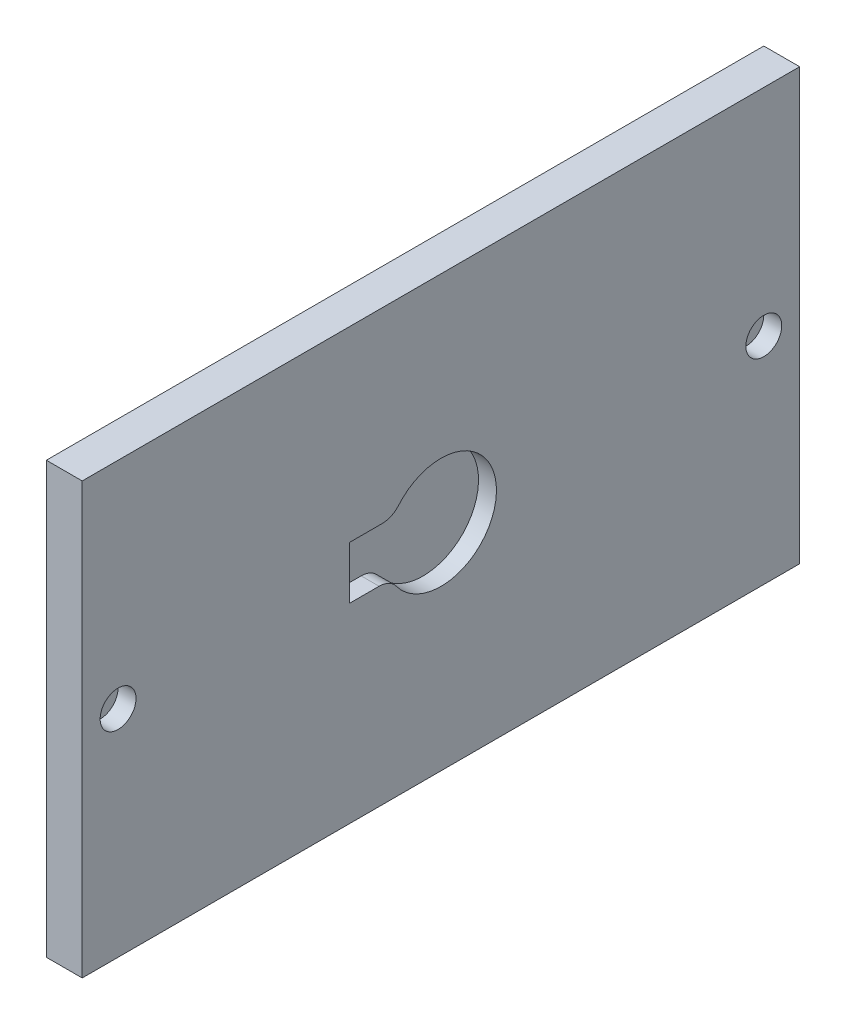
ISO-10303-21;
HEADER;
FILE_DESCRIPTION(('STEP AP214'),'2;1');
FILE_NAME('part.step','',(''),(''),'','','');
FILE_SCHEMA(('AUTOMOTIVE_DESIGN { 1 0 10303 214 1 1 1 1 }'));
ENDSEC;
DATA;
#1=APPLICATION_CONTEXT('core data for automotive mechanical design processes');
#2=APPLICATION_PROTOCOL_DEFINITION('international standard','automotive_design',2000,#1);
#3=PRODUCT_CONTEXT('',#1,'mechanical');
#4=PRODUCT('Part','Part','',(#3));
#5=PRODUCT_RELATED_PRODUCT_CATEGORY('part','',(#4));
#6=PRODUCT_DEFINITION_FORMATION('','',#4);
#7=PRODUCT_DEFINITION_CONTEXT('part definition',#1,'design');
#8=PRODUCT_DEFINITION('design','',#6,#7);
#9=PRODUCT_DEFINITION_SHAPE('','',#8);
#10=(LENGTH_UNIT() NAMED_UNIT(*) SI_UNIT(.MILLI.,.METRE.));
#11=(NAMED_UNIT(*) PLANE_ANGLE_UNIT() SI_UNIT($,.RADIAN.));
#12=(NAMED_UNIT(*) SI_UNIT($,.STERADIAN.) SOLID_ANGLE_UNIT());
#13=UNCERTAINTY_MEASURE_WITH_UNIT(LENGTH_MEASURE(1.E-05),#10,'distance_accuracy_value','');
#14=(GEOMETRIC_REPRESENTATION_CONTEXT(3) GLOBAL_UNCERTAINTY_ASSIGNED_CONTEXT((#13)) GLOBAL_UNIT_ASSIGNED_CONTEXT((#10,
#11,#12)) REPRESENTATION_CONTEXT('',''));
#15=CARTESIAN_POINT('',(0.,0.,0.));
#16=DIRECTION('',(0.,0.,1.));
#17=DIRECTION('',(1.,0.,0.));
#18=AXIS2_PLACEMENT_3D('',#15,#16,#17);
#19=CARTESIAN_POINT('',(12.7,-76.2,127.));
#20=DIRECTION('',(0.,0.,-1.));
#21=DIRECTION('',(-1.,0.,0.));
#22=AXIS2_PLACEMENT_3D('',#19,#20,#21);
#23=PLANE('',#22);
#24=DIRECTION('',(0.,-1.,0.));
#25=VECTOR('',#24,1.);
#26=CARTESIAN_POINT('',(0.,-76.2,127.));
#27=LINE('',#26,#25);
#28=CARTESIAN_POINT('',(0.,76.2,127.));
#29=VERTEX_POINT('',#28);
#30=CARTESIAN_POINT('',(0.,-76.2,127.));
#31=VERTEX_POINT('',#30);
#32=EDGE_CURVE('E168',#29,#31,#27,.T.);
#33=ORIENTED_EDGE('',*,*,#32,.T.);
#34=DIRECTION('',(-1.,0.,0.));
#35=VECTOR('',#34,1.);
#36=CARTESIAN_POINT('',(12.7,-76.2,127.));
#37=LINE('',#36,#35);
#38=CARTESIAN_POINT('',(12.7,-76.2,127.));
#39=VERTEX_POINT('',#38);
#40=EDGE_CURVE('E203',#39,#31,#37,.T.);
#41=ORIENTED_EDGE('',*,*,#40,.F.);
#42=DIRECTION('',(0.,-1.,0.));
#43=VECTOR('',#42,1.);
#44=CARTESIAN_POINT('',(12.7,-76.2,127.));
#45=LINE('',#44,#43);
#46=CARTESIAN_POINT('',(12.7,76.2,127.));
#47=VERTEX_POINT('',#46);
#48=EDGE_CURVE('E177',#47,#39,#45,.T.);
#49=ORIENTED_EDGE('',*,*,#48,.F.);
#50=DIRECTION('',(-1.,0.,0.));
#51=VECTOR('',#50,1.);
#52=CARTESIAN_POINT('',(12.7,76.2,127.));
#53=LINE('',#52,#51);
#54=EDGE_CURVE('E187',#47,#29,#53,.T.);
#55=ORIENTED_EDGE('',*,*,#54,.T.);
#56=EDGE_LOOP('',(#33,#41,#49,#55));
#57=FACE_BOUND('',#56,.T.);
#58=ADVANCED_FACE('F33',(#57),#23,.F.);
#59=CARTESIAN_POINT('',(12.7,-76.2,-127.));
#60=DIRECTION('',(0.,1.,0.));
#61=DIRECTION('',(0.,0.,1.));
#62=AXIS2_PLACEMENT_3D('',#59,#60,#61);
#63=PLANE('',#62);
#64=CARTESIAN_POINT('',(6.23633701428616,-76.2,114.3));
#65=DIRECTION('',(0.,-1.,0.));
#66=DIRECTION('',(0.,0.,-1.));
#67=AXIS2_PLACEMENT_3D('',#64,#65,#66);
#68=CIRCLE('',#67,3.17499999999999);
#69=CARTESIAN_POINT('',(6.23633701428616,-76.2,111.125));
#70=VERTEX_POINT('',#69);
#71=EDGE_CURVE('E142',#70,#70,#68,.T.);
#72=ORIENTED_EDGE('',*,*,#71,.F.);
#73=EDGE_LOOP('',(#72));
#74=FACE_BOUND('',#73,.T.);
#75=CARTESIAN_POINT('',(6.23633701428616,-76.2,0.));
#76=DIRECTION('',(0.,-1.,0.));
#77=DIRECTION('',(0.,0.,-1.));
#78=AXIS2_PLACEMENT_3D('',#75,#76,#77);
#79=CIRCLE('',#78,3.17499999999999);
#80=CARTESIAN_POINT('',(6.23633701428616,-76.2,-3.175));
#81=VERTEX_POINT('',#80);
#82=EDGE_CURVE('E152',#81,#81,#79,.T.);
#83=ORIENTED_EDGE('',*,*,#82,.F.);
#84=EDGE_LOOP('',(#83));
#85=FACE_BOUND('',#84,.T.);
#86=CARTESIAN_POINT('',(6.23633701428616,-76.2,-114.3));
#87=DIRECTION('',(0.,-1.,0.));
#88=DIRECTION('',(0.,0.,-1.));
#89=AXIS2_PLACEMENT_3D('',#86,#87,#88);
#90=CIRCLE('',#89,3.17499999999999);
#91=CARTESIAN_POINT('',(6.23633701428616,-76.2,-117.475));
#92=VERTEX_POINT('',#91);
#93=EDGE_CURVE('E158',#92,#92,#90,.T.);
#94=ORIENTED_EDGE('',*,*,#93,.F.);
#95=EDGE_LOOP('',(#94));
#96=FACE_BOUND('',#95,.T.);
#97=DIRECTION('',(0.,0.,-1.));
#98=VECTOR('',#97,1.);
#99=CARTESIAN_POINT('',(0.,-76.2,-127.));
#100=LINE('',#99,#98);
#101=CARTESIAN_POINT('',(0.,-76.2,-127.));
#102=VERTEX_POINT('',#101);
#103=EDGE_CURVE('E190',#31,#102,#100,.T.);
#104=ORIENTED_EDGE('',*,*,#103,.T.);
#105=DIRECTION('',(-1.,0.,0.));
#106=VECTOR('',#105,1.);
#107=CARTESIAN_POINT('',(12.7,-76.2,-127.));
#108=LINE('',#107,#106);
#109=CARTESIAN_POINT('',(12.7,-76.2,-127.));
#110=VERTEX_POINT('',#109);
#111=EDGE_CURVE('E200',#110,#102,#108,.T.);
#112=ORIENTED_EDGE('',*,*,#111,.F.);
#113=DIRECTION('',(0.,0.,-1.));
#114=VECTOR('',#113,1.);
#115=CARTESIAN_POINT('',(12.7,-76.2,-127.));
#116=LINE('',#115,#114);
#117=EDGE_CURVE('E180',#39,#110,#116,.T.);
#118=ORIENTED_EDGE('',*,*,#117,.F.);
#119=ORIENTED_EDGE('',*,*,#40,.T.);
#120=EDGE_LOOP('',(#104,#112,#118,#119));
#121=FACE_BOUND('',#120,.T.);
#122=ADVANCED_FACE('F244',(#74,#85,#96,#121),#63,.F.);
#123=CARTESIAN_POINT('',(12.7,-76.2,-127.));
#124=DIRECTION('',(0.,0.,1.));
#125=DIRECTION('',(1.,0.,0.));
#126=AXIS2_PLACEMENT_3D('',#123,#124,#125);
#127=PLANE('',#126);
#128=DIRECTION('',(0.,1.,0.));
#129=VECTOR('',#128,1.);
#130=CARTESIAN_POINT('',(0.,-76.2,-127.));
#131=LINE('',#130,#129);
#132=CARTESIAN_POINT('',(0.,76.2,-127.));
#133=VERTEX_POINT('',#132);
#134=EDGE_CURVE('E192',#102,#133,#131,.T.);
#135=ORIENTED_EDGE('',*,*,#134,.T.);
#136=DIRECTION('',(-1.,0.,0.));
#137=VECTOR('',#136,1.);
#138=CARTESIAN_POINT('',(12.7,76.2,-127.));
#139=LINE('',#138,#137);
#140=CARTESIAN_POINT('',(12.7,76.2,-127.));
#141=VERTEX_POINT('',#140);
#142=EDGE_CURVE('E197',#141,#133,#139,.T.);
#143=ORIENTED_EDGE('',*,*,#142,.F.);
#144=DIRECTION('',(0.,1.,0.));
#145=VECTOR('',#144,1.);
#146=CARTESIAN_POINT('',(12.7,-76.2,-127.));
#147=LINE('',#146,#145);
#148=EDGE_CURVE('E183',#110,#141,#147,.T.);
#149=ORIENTED_EDGE('',*,*,#148,.F.);
#150=ORIENTED_EDGE('',*,*,#111,.T.);
#151=EDGE_LOOP('',(#135,#143,#149,#150));
#152=FACE_BOUND('',#151,.T.);
#153=ADVANCED_FACE('F250',(#152),#127,.F.);
#154=CARTESIAN_POINT('',(12.7,76.2,-127.));
#155=DIRECTION('',(0.,-1.,0.));
#156=DIRECTION('',(0.,0.,-1.));
#157=AXIS2_PLACEMENT_3D('',#154,#155,#156);
#158=PLANE('',#157);
#159=DIRECTION('',(0.,0.,1.));
#160=VECTOR('',#159,1.);
#161=CARTESIAN_POINT('',(0.,76.2,-127.));
#162=LINE('',#161,#160);
#163=EDGE_CURVE('E181',#133,#29,#162,.T.);
#164=ORIENTED_EDGE('',*,*,#163,.T.);
#165=ORIENTED_EDGE('',*,*,#54,.F.);
#166=DIRECTION('',(0.,0.,1.));
#167=VECTOR('',#166,1.);
#168=CARTESIAN_POINT('',(12.7,76.2,-127.));
#169=LINE('',#168,#167);
#170=EDGE_CURVE('E185',#141,#47,#169,.T.);
#171=ORIENTED_EDGE('',*,*,#170,.F.);
#172=ORIENTED_EDGE('',*,*,#142,.T.);
#173=EDGE_LOOP('',(#164,#165,#171,#172));
#174=FACE_BOUND('',#173,.T.);
#175=ADVANCED_FACE('F256',(#174),#158,.F.);
#176=CARTESIAN_POINT('',(12.7,0.,0.));
#177=DIRECTION('',(1.,0.,0.));
#178=DIRECTION('',(0.,0.,-1.));
#179=AXIS2_PLACEMENT_3D('',#176,#177,#178);
#180=PLANE('',#179);
#181=CARTESIAN_POINT('',(12.7,0.,0.));
#182=DIRECTION('',(1.,0.,0.));
#183=DIRECTION('',(0.,0.,-1.));
#184=AXIS2_PLACEMENT_3D('',#181,#182,#183);
#185=CIRCLE('',#184,19.6517881120269);
#186=CARTESIAN_POINT('',(12.7,-11.7131699635064,15.779557199301));
#187=VERTEX_POINT('',#186);
#188=CARTESIAN_POINT('',(12.7,12.7204921921849,14.9793809748121));
#189=VERTEX_POINT('',#188);
#190=EDGE_CURVE('E232',#187,#189,#185,.T.);
#191=ORIENTED_EDGE('',*,*,#190,.F.);
#192=CARTESIAN_POINT('',(12.7,-16.2549630366414,21.89809588765));
#193=DIRECTION('',(1.,0.,0.));
#194=DIRECTION('',(0.,0.,-1.));
#195=AXIS2_PLACEMENT_3D('',#192,#193,#194);
#196=CIRCLE('',#195,7.62);
#197=CARTESIAN_POINT('',(12.7,-8.63496303664135,21.89809588765));
#198=VERTEX_POINT('',#197);
#199=EDGE_CURVE('E213',#187,#198,#196,.T.);
#200=ORIENTED_EDGE('',*,*,#199,.T.);
#201=DIRECTION('',(0.,0.,1.));
#202=VECTOR('',#201,1.);
#203=CARTESIAN_POINT('',(12.7,-8.63496303664135,0.));
#204=LINE('',#203,#202);
#205=CARTESIAN_POINT('',(12.7,-8.63496303664135,32.324736447741));
#206=VERTEX_POINT('',#205);
#207=EDGE_CURVE('E226',#198,#206,#204,.T.);
#208=ORIENTED_EDGE('',*,*,#207,.T.);
#209=DIRECTION('',(0.,1.,0.));
#210=VECTOR('',#209,1.);
#211=CARTESIAN_POINT('',(12.7,0.,32.324736447741));
#212=LINE('',#211,#210);
#213=CARTESIAN_POINT('',(12.7,10.0328754415813,32.324736447741));
#214=VERTEX_POINT('',#213);
#215=EDGE_CURVE('E234',#206,#214,#212,.T.);
#216=ORIENTED_EDGE('',*,*,#215,.T.);
#217=DIRECTION('',(0.,0.,1.));
#218=VECTOR('',#217,1.);
#219=CARTESIAN_POINT('',(12.7,10.0328754415813,0.));
#220=LINE('',#219,#218);
#221=CARTESIAN_POINT('',(12.7,10.0328754415813,20.7876505519817));
#222=VERTEX_POINT('',#221);
#223=EDGE_CURVE('E140',#222,#214,#220,.T.);
#224=ORIENTED_EDGE('',*,*,#223,.F.);
#225=CARTESIAN_POINT('',(12.7,17.6528754415813,20.7876505519817));
#226=DIRECTION('',(1.,0.,0.));
#227=DIRECTION('',(0.,0.,-1.));
#228=AXIS2_PLACEMENT_3D('',#225,#226,#227);
#229=CIRCLE('',#228,7.62);
#230=EDGE_CURVE('E211',#222,#189,#229,.T.);
#231=ORIENTED_EDGE('',*,*,#230,.T.);
#232=EDGE_LOOP('',(#191,#200,#208,#216,#224,#231));
#233=FACE_BOUND('',#232,.T.);
#234=CARTESIAN_POINT('',(12.7,0.,-114.3));
#235=DIRECTION('',(1.,0.,0.));
#236=DIRECTION('',(0.,0.,-1.));
#237=AXIS2_PLACEMENT_3D('',#234,#235,#236);
#238=CIRCLE('',#237,6.35);
#239=CARTESIAN_POINT('',(12.7,0.,-120.65));
#240=VERTEX_POINT('',#239);
#241=EDGE_CURVE('E169',#240,#240,#238,.T.);
#242=ORIENTED_EDGE('',*,*,#241,.F.);
#243=EDGE_LOOP('',(#242));
#244=FACE_BOUND('',#243,.T.);
#245=CARTESIAN_POINT('',(12.7,0.,114.3));
#246=DIRECTION('',(1.,0.,0.));
#247=DIRECTION('',(0.,0.,-1.));
#248=AXIS2_PLACEMENT_3D('',#245,#246,#247);
#249=CIRCLE('',#248,6.35);
#250=CARTESIAN_POINT('',(12.7,0.,107.95));
#251=VERTEX_POINT('',#250);
#252=EDGE_CURVE('E164',#251,#251,#249,.T.);
#253=ORIENTED_EDGE('',*,*,#252,.F.);
#254=EDGE_LOOP('',(#253));
#255=FACE_BOUND('',#254,.T.);
#256=ORIENTED_EDGE('',*,*,#48,.T.);
#257=ORIENTED_EDGE('',*,*,#117,.T.);
#258=ORIENTED_EDGE('',*,*,#148,.T.);
#259=ORIENTED_EDGE('',*,*,#170,.T.);
#260=EDGE_LOOP('',(#256,#257,#258,#259));
#261=FACE_BOUND('',#260,.T.);
#262=ADVANCED_FACE('F230',(#233,#244,#255,#261),#180,.T.);
#263=CARTESIAN_POINT('',(0.,0.,0.));
#264=DIRECTION('',(1.,0.,0.));
#265=DIRECTION('',(0.,0.,-1.));
#266=AXIS2_PLACEMENT_3D('',#263,#264,#265);
#267=PLANE('',#266);
#268=ORIENTED_EDGE('',*,*,#32,.F.);
#269=ORIENTED_EDGE('',*,*,#163,.F.);
#270=ORIENTED_EDGE('',*,*,#134,.F.);
#271=ORIENTED_EDGE('',*,*,#103,.F.);
#272=EDGE_LOOP('',(#268,#269,#270,#271));
#273=FACE_BOUND('',#272,.T.);
#274=ADVANCED_FACE('F261',(#273),#267,.F.);
#275=CARTESIAN_POINT('',(6.35,0.,114.3));
#276=DIRECTION('',(1.,0.,0.));
#277=DIRECTION('',(0.,0.,-1.));
#278=AXIS2_PLACEMENT_3D('',#275,#276,#277);
#279=CYLINDRICAL_SURFACE('',#278,6.35);
#280=CARTESIAN_POINT('',(6.35,0.,114.3));
#281=DIRECTION('',(1.,0.,0.));
#282=DIRECTION('',(0.,0.,-1.));
#283=AXIS2_PLACEMENT_3D('',#280,#281,#282);
#284=CIRCLE('',#283,6.35);
#285=CARTESIAN_POINT('',(6.35,0.,107.95));
#286=VERTEX_POINT('',#285);
#287=EDGE_CURVE('E172',#286,#286,#284,.T.);
#288=ORIENTED_EDGE('',*,*,#287,.F.);
#289=EDGE_LOOP('',(#288));
#290=FACE_BOUND('',#289,.T.);
#291=ORIENTED_EDGE('',*,*,#252,.T.);
#292=EDGE_LOOP('',(#291));
#293=FACE_BOUND('',#292,.T.);
#294=ADVANCED_FACE('F264',(#290,#293),#279,.F.);
#295=CARTESIAN_POINT('',(6.35,0.,114.3));
#296=DIRECTION('',(1.,0.,0.));
#297=DIRECTION('',(0.,0.,-1.));
#298=AXIS2_PLACEMENT_3D('',#295,#296,#297);
#299=PLANE('',#298);
#300=ORIENTED_EDGE('',*,*,#287,.T.);
#301=EDGE_LOOP('',(#300));
#302=FACE_BOUND('',#301,.T.);
#303=ADVANCED_FACE('F270',(#302),#299,.T.);
#304=CARTESIAN_POINT('',(6.35,0.,-114.3));
#305=DIRECTION('',(1.,0.,0.));
#306=DIRECTION('',(0.,0.,-1.));
#307=AXIS2_PLACEMENT_3D('',#304,#305,#306);
#308=CYLINDRICAL_SURFACE('',#307,6.35);
#309=CARTESIAN_POINT('',(6.35,0.,-114.3));
#310=DIRECTION('',(1.,0.,0.));
#311=DIRECTION('',(0.,0.,-1.));
#312=AXIS2_PLACEMENT_3D('',#309,#310,#311);
#313=CIRCLE('',#312,6.35);
#314=CARTESIAN_POINT('',(6.35,0.,-120.65));
#315=VERTEX_POINT('',#314);
#316=EDGE_CURVE('E165',#315,#315,#313,.T.);
#317=ORIENTED_EDGE('',*,*,#316,.F.);
#318=EDGE_LOOP('',(#317));
#319=FACE_BOUND('',#318,.T.);
#320=ORIENTED_EDGE('',*,*,#241,.T.);
#321=EDGE_LOOP('',(#320));
#322=FACE_BOUND('',#321,.T.);
#323=ADVANCED_FACE('F274',(#319,#322),#308,.F.);
#324=CARTESIAN_POINT('',(6.35,0.,-114.3));
#325=DIRECTION('',(1.,0.,0.));
#326=DIRECTION('',(0.,0.,-1.));
#327=AXIS2_PLACEMENT_3D('',#324,#325,#326);
#328=PLANE('',#327);
#329=ORIENTED_EDGE('',*,*,#316,.T.);
#330=EDGE_LOOP('',(#329));
#331=FACE_BOUND('',#330,.T.);
#332=ADVANCED_FACE('F278',(#331),#328,.T.);
#333=CARTESIAN_POINT('',(6.23633701428616,-63.5,-114.3));
#334=DIRECTION('',(0.,-1.,0.));
#335=DIRECTION('',(0.,0.,-1.));
#336=AXIS2_PLACEMENT_3D('',#333,#334,#335);
#337=CONICAL_SURFACE('',#336,3.17499999999999,1.02974425867665);
#338=CARTESIAN_POINT('',(6.23633701428616,-61.5922675345875,-114.3));
#339=VERTEX_POINT('',#338);
#340=VERTEX_LOOP('',#339);
#341=FACE_BOUND('',#340,.T.);
#342=CARTESIAN_POINT('',(6.23633701428616,-63.5,-114.3));
#343=DIRECTION('',(0.,-1.,0.));
#344=DIRECTION('',(0.,0.,-1.));
#345=AXIS2_PLACEMENT_3D('',#342,#343,#344);
#346=CIRCLE('',#345,3.17499999999999);
#347=CARTESIAN_POINT('',(6.23633701428616,-63.5,-117.475));
#348=VERTEX_POINT('',#347);
#349=EDGE_CURVE('E161',#348,#348,#346,.T.);
#350=ORIENTED_EDGE('',*,*,#349,.T.);
#351=EDGE_LOOP('',(#350));
#352=FACE_BOUND('',#351,.T.);
#353=ADVANCED_FACE('F282',(#341,#352),#337,.F.);
#354=CARTESIAN_POINT('',(6.23633701428616,-76.2,-114.3));
#355=DIRECTION('',(0.,-1.,0.));
#356=DIRECTION('',(0.,0.,-1.));
#357=AXIS2_PLACEMENT_3D('',#354,#355,#356);
#358=CYLINDRICAL_SURFACE('',#357,3.17499999999999);
#359=ORIENTED_EDGE('',*,*,#349,.F.);
#360=EDGE_LOOP('',(#359));
#361=FACE_BOUND('',#360,.T.);
#362=ORIENTED_EDGE('',*,*,#93,.T.);
#363=EDGE_LOOP('',(#362));
#364=FACE_BOUND('',#363,.T.);
#365=ADVANCED_FACE('F286',(#361,#364),#358,.F.);
#366=CARTESIAN_POINT('',(6.23633701428616,-63.5,0.));
#367=DIRECTION('',(0.,-1.,0.));
#368=DIRECTION('',(0.,0.,-1.));
#369=AXIS2_PLACEMENT_3D('',#366,#367,#368);
#370=CONICAL_SURFACE('',#369,3.17499999999999,1.02974425867665);
#371=CARTESIAN_POINT('',(6.23633701428616,-61.5922675345875,0.));
#372=VERTEX_POINT('',#371);
#373=VERTEX_LOOP('',#372);
#374=FACE_BOUND('',#373,.T.);
#375=CARTESIAN_POINT('',(6.23633701428616,-63.5,0.));
#376=DIRECTION('',(0.,-1.,0.));
#377=DIRECTION('',(0.,0.,-1.));
#378=AXIS2_PLACEMENT_3D('',#375,#376,#377);
#379=CIRCLE('',#378,3.17499999999999);
#380=CARTESIAN_POINT('',(6.23633701428616,-63.5,-3.17499999999999));
#381=VERTEX_POINT('',#380);
#382=EDGE_CURVE('E155',#381,#381,#379,.T.);
#383=ORIENTED_EDGE('',*,*,#382,.T.);
#384=EDGE_LOOP('',(#383));
#385=FACE_BOUND('',#384,.T.);
#386=ADVANCED_FACE('F290',(#374,#385),#370,.F.);
#387=CARTESIAN_POINT('',(6.23633701428616,-76.2,0.));
#388=DIRECTION('',(0.,-1.,0.));
#389=DIRECTION('',(0.,0.,-1.));
#390=AXIS2_PLACEMENT_3D('',#387,#388,#389);
#391=CYLINDRICAL_SURFACE('',#390,3.17499999999999);
#392=ORIENTED_EDGE('',*,*,#382,.F.);
#393=EDGE_LOOP('',(#392));
#394=FACE_BOUND('',#393,.T.);
#395=ORIENTED_EDGE('',*,*,#82,.T.);
#396=EDGE_LOOP('',(#395));
#397=FACE_BOUND('',#396,.T.);
#398=ADVANCED_FACE('F294',(#394,#397),#391,.F.);
#399=CARTESIAN_POINT('',(6.23633701428616,-63.5,114.3));
#400=DIRECTION('',(0.,-1.,0.));
#401=DIRECTION('',(0.,0.,-1.));
#402=AXIS2_PLACEMENT_3D('',#399,#400,#401);
#403=CONICAL_SURFACE('',#402,3.17499999999999,1.02974425867665);
#404=CARTESIAN_POINT('',(6.23633701428616,-61.5922675345875,114.3));
#405=VERTEX_POINT('',#404);
#406=VERTEX_LOOP('',#405);
#407=FACE_BOUND('',#406,.T.);
#408=CARTESIAN_POINT('',(6.23633701428616,-63.5,114.3));
#409=DIRECTION('',(0.,-1.,0.));
#410=DIRECTION('',(0.,0.,-1.));
#411=AXIS2_PLACEMENT_3D('',#408,#409,#410);
#412=CIRCLE('',#411,3.17499999999999);
#413=CARTESIAN_POINT('',(6.23633701428616,-63.5,111.125));
#414=VERTEX_POINT('',#413);
#415=EDGE_CURVE('E149',#414,#414,#412,.T.);
#416=ORIENTED_EDGE('',*,*,#415,.T.);
#417=EDGE_LOOP('',(#416));
#418=FACE_BOUND('',#417,.T.);
#419=ADVANCED_FACE('F298',(#407,#418),#403,.F.);
#420=CARTESIAN_POINT('',(6.23633701428616,-76.2,114.3));
#421=DIRECTION('',(0.,-1.,0.));
#422=DIRECTION('',(0.,0.,-1.));
#423=AXIS2_PLACEMENT_3D('',#420,#421,#422);
#424=CYLINDRICAL_SURFACE('',#423,3.17499999999999);
#425=ORIENTED_EDGE('',*,*,#415,.F.);
#426=EDGE_LOOP('',(#425));
#427=FACE_BOUND('',#426,.T.);
#428=ORIENTED_EDGE('',*,*,#71,.T.);
#429=EDGE_LOOP('',(#428));
#430=FACE_BOUND('',#429,.T.);
#431=ADVANCED_FACE('F302',(#427,#430),#424,.F.);
#432=CARTESIAN_POINT('',(6.35,0.,0.));
#433=DIRECTION('',(1.,0.,0.));
#434=DIRECTION('',(0.,0.,-1.));
#435=AXIS2_PLACEMENT_3D('',#432,#433,#434);
#436=CYLINDRICAL_SURFACE('',#435,19.6517881120269);
#437=CARTESIAN_POINT('',(6.35,0.,0.));
#438=DIRECTION('',(1.,0.,0.));
#439=DIRECTION('',(0.,0.,-1.));
#440=AXIS2_PLACEMENT_3D('',#437,#438,#439);
#441=CIRCLE('',#440,19.6517881120269);
#442=CARTESIAN_POINT('',(6.35,-11.7131699635064,15.779557199301));
#443=VERTEX_POINT('',#442);
#444=CARTESIAN_POINT('',(6.35,12.7204921921849,14.9793809748121));
#445=VERTEX_POINT('',#444);
#446=EDGE_CURVE('E125',#443,#445,#441,.T.);
#447=ORIENTED_EDGE('',*,*,#446,.F.);
#448=DIRECTION('',(1.,0.,0.));
#449=VECTOR('',#448,1.);
#450=CARTESIAN_POINT('',(6.35,-11.7131699635064,15.779557199301));
#451=LINE('',#450,#449);
#452=EDGE_CURVE('E208',#443,#187,#451,.T.);
#453=ORIENTED_EDGE('',*,*,#452,.T.);
#454=ORIENTED_EDGE('',*,*,#190,.T.);
#455=DIRECTION('',(1.,0.,0.));
#456=VECTOR('',#455,1.);
#457=CARTESIAN_POINT('',(6.35,12.7204921921849,14.9793809748121));
#458=LINE('',#457,#456);
#459=EDGE_CURVE('E206',#189,#445,#458,.F.);
#460=ORIENTED_EDGE('',*,*,#459,.T.);
#461=EDGE_LOOP('',(#447,#453,#454,#460));
#462=FACE_BOUND('',#461,.T.);
#463=ADVANCED_FACE('F222',(#462),#436,.F.);
#464=CARTESIAN_POINT('',(6.35,-8.63496303664135,0.));
#465=DIRECTION('',(0.,1.,0.));
#466=DIRECTION('',(0.,0.,1.));
#467=AXIS2_PLACEMENT_3D('',#464,#465,#466);
#468=PLANE('',#467);
#469=ORIENTED_EDGE('',*,*,#207,.F.);
#470=DIRECTION('',(-1.,0.,0.));
#471=VECTOR('',#470,1.);
#472=CARTESIAN_POINT('',(6.35,-8.63496303664135,21.89809588765));
#473=LINE('',#472,#471);
#474=CARTESIAN_POINT('',(6.35,-8.63496303664135,21.89809588765));
#475=VERTEX_POINT('',#474);
#476=EDGE_CURVE('E54',#198,#475,#473,.T.);
#477=ORIENTED_EDGE('',*,*,#476,.T.);
#478=DIRECTION('',(0.,0.,1.));
#479=VECTOR('',#478,1.);
#480=CARTESIAN_POINT('',(6.35,-8.63496303664135,0.));
#481=LINE('',#480,#479);
#482=CARTESIAN_POINT('',(6.35,-8.63496303664135,32.324736447741));
#483=VERTEX_POINT('',#482);
#484=EDGE_CURVE('E136',#475,#483,#481,.T.);
#485=ORIENTED_EDGE('',*,*,#484,.T.);
#486=DIRECTION('',(1.,0.,0.));
#487=VECTOR('',#486,1.);
#488=CARTESIAN_POINT('',(6.35,-8.63496303664135,32.324736447741));
#489=LINE('',#488,#487);
#490=EDGE_CURVE('E135',#483,#206,#489,.T.);
#491=ORIENTED_EDGE('',*,*,#490,.T.);
#492=EDGE_LOOP('',(#469,#477,#485,#491));
#493=FACE_BOUND('',#492,.T.);
#494=ADVANCED_FACE('F233',(#493),#468,.T.);
#495=CARTESIAN_POINT('',(6.35,0.,32.324736447741));
#496=DIRECTION('',(0.,0.,-1.));
#497=DIRECTION('',(-1.,0.,0.));
#498=AXIS2_PLACEMENT_3D('',#495,#496,#497);
#499=PLANE('',#498);
#500=ORIENTED_EDGE('',*,*,#215,.F.);
#501=ORIENTED_EDGE('',*,*,#490,.F.);
#502=DIRECTION('',(0.,1.,0.));
#503=VECTOR('',#502,1.);
#504=CARTESIAN_POINT('',(6.35,0.,32.324736447741));
#505=LINE('',#504,#503);
#506=CARTESIAN_POINT('',(6.35,10.0328754415813,32.324736447741));
#507=VERTEX_POINT('',#506);
#508=EDGE_CURVE('E120',#483,#507,#505,.T.);
#509=ORIENTED_EDGE('',*,*,#508,.T.);
#510=DIRECTION('',(1.,0.,0.));
#511=VECTOR('',#510,1.);
#512=CARTESIAN_POINT('',(6.35,10.0328754415813,32.324736447741));
#513=LINE('',#512,#511);
#514=EDGE_CURVE('E132',#507,#214,#513,.T.);
#515=ORIENTED_EDGE('',*,*,#514,.T.);
#516=EDGE_LOOP('',(#500,#501,#509,#515));
#517=FACE_BOUND('',#516,.T.);
#518=ADVANCED_FACE('F131',(#517),#499,.T.);
#519=CARTESIAN_POINT('',(6.35,10.0328754415813,0.));
#520=DIRECTION('',(0.,1.,0.));
#521=DIRECTION('',(0.,0.,1.));
#522=AXIS2_PLACEMENT_3D('',#519,#520,#521);
#523=PLANE('',#522);
#524=DIRECTION('',(0.,0.,1.));
#525=VECTOR('',#524,1.);
#526=CARTESIAN_POINT('',(6.35,10.0328754415813,0.));
#527=LINE('',#526,#525);
#528=CARTESIAN_POINT('',(6.35,10.0328754415813,20.7876505519817));
#529=VERTEX_POINT('',#528);
#530=EDGE_CURVE('E117',#529,#507,#527,.T.);
#531=ORIENTED_EDGE('',*,*,#530,.F.);
#532=DIRECTION('',(1.,0.,0.));
#533=VECTOR('',#532,1.);
#534=CARTESIAN_POINT('',(6.35,10.0328754415813,20.7876505519817));
#535=LINE('',#534,#533);
#536=EDGE_CURVE('E216',#529,#222,#535,.T.);
#537=ORIENTED_EDGE('',*,*,#536,.T.);
#538=ORIENTED_EDGE('',*,*,#223,.T.);
#539=ORIENTED_EDGE('',*,*,#514,.F.);
#540=EDGE_LOOP('',(#531,#537,#538,#539));
#541=FACE_BOUND('',#540,.T.);
#542=ADVANCED_FACE('F138',(#541),#523,.F.);
#543=CARTESIAN_POINT('',(6.35,0.,0.));
#544=DIRECTION('',(1.,0.,0.));
#545=DIRECTION('',(0.,0.,-1.));
#546=AXIS2_PLACEMENT_3D('',#543,#544,#545);
#547=PLANE('',#546);
#548=ORIENTED_EDGE('',*,*,#484,.F.);
#549=CARTESIAN_POINT('',(6.35,-16.2549630366414,21.89809588765));
#550=DIRECTION('',(1.,0.,0.));
#551=DIRECTION('',(0.,0.,-1.));
#552=AXIS2_PLACEMENT_3D('',#549,#550,#551);
#553=CIRCLE('',#552,7.62);
#554=EDGE_CURVE('E41',#475,#443,#553,.F.);
#555=ORIENTED_EDGE('',*,*,#554,.T.);
#556=ORIENTED_EDGE('',*,*,#446,.T.);
#557=CARTESIAN_POINT('',(6.35,17.6528754415813,20.7876505519817));
#558=DIRECTION('',(1.,0.,0.));
#559=DIRECTION('',(0.,0.,-1.));
#560=AXIS2_PLACEMENT_3D('',#557,#558,#559);
#561=CIRCLE('',#560,7.62);
#562=EDGE_CURVE('E11',#445,#529,#561,.F.);
#563=ORIENTED_EDGE('',*,*,#562,.T.);
#564=ORIENTED_EDGE('',*,*,#530,.T.);
#565=ORIENTED_EDGE('',*,*,#508,.F.);
#566=EDGE_LOOP('',(#548,#555,#556,#563,#564,#565));
#567=FACE_BOUND('',#566,.T.);
#568=ADVANCED_FACE('F119',(#567),#547,.T.);
#569=CARTESIAN_POINT('',(6.35,-16.2549630366414,21.89809588765));
#570=DIRECTION('',(1.,0.,0.));
#571=DIRECTION('',(0.,0.,-1.));
#572=AXIS2_PLACEMENT_3D('',#569,#570,#571);
#573=CYLINDRICAL_SURFACE('',#572,7.62);
#574=ORIENTED_EDGE('',*,*,#554,.F.);
#575=ORIENTED_EDGE('',*,*,#476,.F.);
#576=ORIENTED_EDGE('',*,*,#199,.F.);
#577=ORIENTED_EDGE('',*,*,#452,.F.);
#578=EDGE_LOOP('',(#574,#575,#576,#577));
#579=FACE_BOUND('',#578,.T.);
#580=ADVANCED_FACE('F228',(#579),#573,.T.);
#581=CARTESIAN_POINT('',(6.35,17.6528754415813,20.7876505519817));
#582=DIRECTION('',(1.,0.,0.));
#583=DIRECTION('',(0.,0.,-1.));
#584=AXIS2_PLACEMENT_3D('',#581,#582,#583);
#585=CYLINDRICAL_SURFACE('',#584,7.62);
#586=ORIENTED_EDGE('',*,*,#562,.F.);
#587=ORIENTED_EDGE('',*,*,#459,.F.);
#588=ORIENTED_EDGE('',*,*,#230,.F.);
#589=ORIENTED_EDGE('',*,*,#536,.F.);
#590=EDGE_LOOP('',(#586,#587,#588,#589));
#591=FACE_BOUND('',#590,.T.);
#592=ADVANCED_FACE('F35',(#591),#585,.T.);
#593=CLOSED_SHELL('',(#58,#122,#153,#175,#262,#274,#294,#303,#323,#332,#353,#365,#386,#398,#419,
#431,#463,#494,#518,#542,#568,#580,#592));
#594=MANIFOLD_SOLID_BREP('B2',#593);
#595=ADVANCED_BREP_SHAPE_REPRESENTATION('',(#18,#594),#14);
#596=SHAPE_DEFINITION_REPRESENTATION(#9,#595);
ENDSEC;
END-ISO-10303-21;
